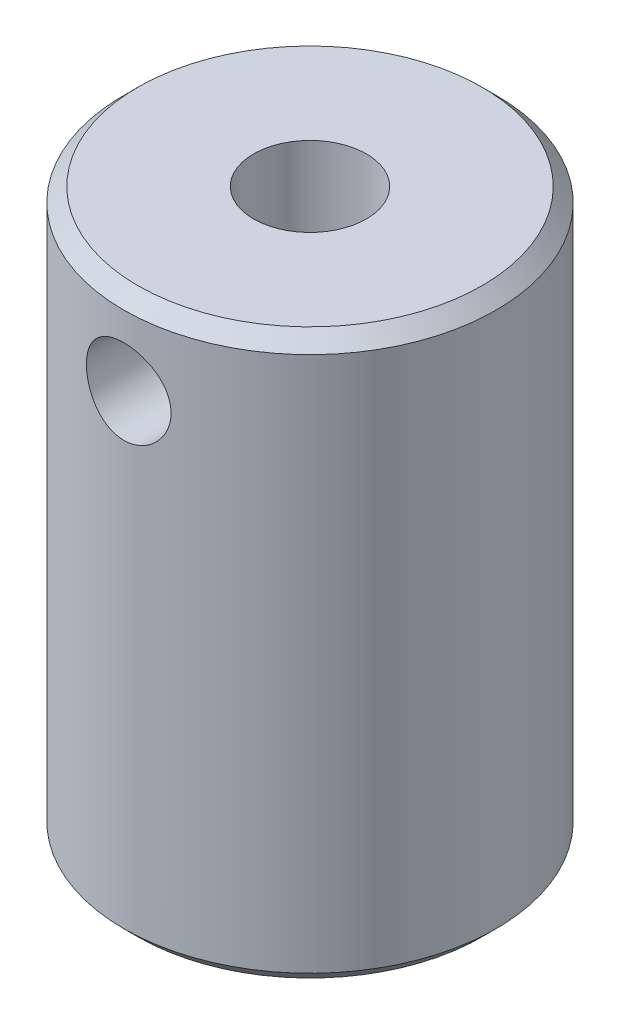
ISO-10303-21;
HEADER;
FILE_DESCRIPTION(('STEP AP214'),'2;1');
FILE_NAME('part.step','',(''),(''),'','','');
FILE_SCHEMA(('AUTOMOTIVE_DESIGN { 1 0 10303 214 1 1 1 1 }'));
ENDSEC;
DATA;
#1=APPLICATION_CONTEXT('core data for automotive mechanical design processes');
#2=APPLICATION_PROTOCOL_DEFINITION('international standard','automotive_design',2000,#1);
#3=PRODUCT_CONTEXT('',#1,'mechanical');
#4=PRODUCT('Part','Part','',(#3));
#5=PRODUCT_RELATED_PRODUCT_CATEGORY('part','',(#4));
#6=PRODUCT_DEFINITION_FORMATION('','',#4);
#7=PRODUCT_DEFINITION_CONTEXT('part definition',#1,'design');
#8=PRODUCT_DEFINITION('design','',#6,#7);
#9=PRODUCT_DEFINITION_SHAPE('','',#8);
#10=(LENGTH_UNIT() NAMED_UNIT(*) SI_UNIT(.MILLI.,.METRE.));
#11=(NAMED_UNIT(*) PLANE_ANGLE_UNIT() SI_UNIT($,.RADIAN.));
#12=(NAMED_UNIT(*) SI_UNIT($,.STERADIAN.) SOLID_ANGLE_UNIT());
#13=UNCERTAINTY_MEASURE_WITH_UNIT(LENGTH_MEASURE(1.E-05),#10,'distance_accuracy_value','');
#14=(GEOMETRIC_REPRESENTATION_CONTEXT(3) GLOBAL_UNCERTAINTY_ASSIGNED_CONTEXT((#13)) GLOBAL_UNIT_ASSIGNED_CONTEXT((#10,
#11,#12)) REPRESENTATION_CONTEXT('',''));
#15=CARTESIAN_POINT('',(0.,0.,0.));
#16=DIRECTION('',(0.,0.,1.));
#17=DIRECTION('',(1.,0.,0.));
#18=AXIS2_PLACEMENT_3D('',#15,#16,#17);
#19=CARTESIAN_POINT('',(0.,-1.2,0.));
#20=DIRECTION('',(0.,1.,0.));
#21=DIRECTION('',(0.,0.,1.));
#22=AXIS2_PLACEMENT_3D('',#19,#20,#21);
#23=CYLINDRICAL_SURFACE('',#22,6.6);
#24=CARTESIAN_POINT('',(0.,-0.700000000000002,0.));
#25=DIRECTION('',(0.,1.,0.));
#26=DIRECTION('',(0.,0.,1.));
#27=AXIS2_PLACEMENT_3D('',#24,#25,#26);
#28=CIRCLE('',#27,6.6);
#29=CARTESIAN_POINT('',(0.,-0.700000000000002,6.6));
#30=VERTEX_POINT('',#29);
#31=EDGE_CURVE('E53',#30,#30,#28,.T.);
#32=ORIENTED_EDGE('',*,*,#31,.T.);
#33=EDGE_LOOP('',(#32));
#34=FACE_BOUND('',#33,.T.);
#35=CARTESIAN_POINT('',(0.,18.3,0.));
#36=DIRECTION('',(0.,1.,0.));
#37=DIRECTION('',(0.,0.,1.));
#38=AXIS2_PLACEMENT_3D('',#35,#36,#37);
#39=CIRCLE('',#38,6.6);
#40=CARTESIAN_POINT('',(0.,18.3,6.6));
#41=VERTEX_POINT('',#40);
#42=EDGE_CURVE('E49',#41,#41,#39,.F.);
#43=ORIENTED_EDGE('',*,*,#42,.T.);
#44=EDGE_LOOP('',(#43));
#45=FACE_BOUND('',#44,.T.);
#46=CARTESIAN_POINT('',(0.,14.3,6.6));
#47=CARTESIAN_POINT('',(-0.0831109671581425,14.3000027190958,6.59999848411111));
#48=CARTESIAN_POINT('',(-0.166254103354805,14.3069307365461,6.59841425607678));
#49=CARTESIAN_POINT('',(-0.330173156759594,14.334427685637,6.5922475921836));
#50=CARTESIAN_POINT('',(-0.410947435332438,14.3550058375732,6.58766312977589));
#51=CARTESIAN_POINT('',(-0.56773660319095,14.4091208291791,6.57600571873763));
#52=CARTESIAN_POINT('',(-0.643756556973884,14.4426435967884,6.56893547314043));
#53=CARTESIAN_POINT('',(-0.789091365495396,14.5216502680285,6.55306692097621));
#54=CARTESIAN_POINT('',(-0.858406287019093,14.5671340525054,6.54426863162391));
#55=CARTESIAN_POINT('',(-0.989560562667828,14.669601226764,6.52573594900884));
#56=CARTESIAN_POINT('',(-1.05126776335229,14.726751544085,6.51598918549954));
#57=CARTESIAN_POINT('',(-1.16430833889966,14.8505713844823,6.49674390709983));
#58=CARTESIAN_POINT('',(-1.2156407287307,14.9172418104167,6.48724541585598));
#59=CARTESIAN_POINT('',(-1.30706759641072,15.0591992331702,6.46944950215326));
#60=CARTESIAN_POINT('',(-1.34701952613945,15.1345801977835,6.46116789483464));
#61=CARTESIAN_POINT('',(-1.41363641830722,15.291205700349,6.44692176885051));
#62=CARTESIAN_POINT('',(-1.44030310630649,15.372449475237,6.44095694929007));
#63=CARTESIAN_POINT('',(-1.47915209647631,15.5370555122699,6.43214606818983));
#64=CARTESIAN_POINT('',(-1.49156935608452,15.6203595578735,6.4292494784034));
#65=CARTESIAN_POINT('',(-1.50229793070892,15.7879149363279,6.42675140440607));
#66=CARTESIAN_POINT('',(-1.50061112331932,15.8721661415974,6.42714948159482));
#67=CARTESIAN_POINT('',(-1.48336810175258,16.0374637300092,6.43115010215516));
#68=CARTESIAN_POINT('',(-1.46808662759663,16.1185405437169,6.43468916477854));
#69=CARTESIAN_POINT('',(-1.42452410952301,16.2769486916929,6.44447242036459));
#70=CARTESIAN_POINT('',(-1.39624228442573,16.3542798005763,6.45071677588463));
#71=CARTESIAN_POINT('',(-1.32723440641527,16.5037644030863,6.4652684630722));
#72=CARTESIAN_POINT('',(-1.28640427251605,16.5758681106582,6.4735929358695));
#73=CARTESIAN_POINT('',(-1.19353186752245,16.7123015318666,6.49135661059448));
#74=CARTESIAN_POINT('',(-1.14148795342281,16.7766301041584,6.50079597578077));
#75=CARTESIAN_POINT('',(-1.0262191080211,16.8972671370926,6.51999691723504));
#76=CARTESIAN_POINT('',(-0.962761000456967,16.9533526559098,6.52976086410899));
#77=CARTESIAN_POINT('',(-0.827227379045836,17.0541235332243,6.54831015582949));
#78=CARTESIAN_POINT('',(-0.755151684054483,17.0988086520197,6.5570954800976));
#79=CARTESIAN_POINT('',(-0.604144795079495,17.1755722327829,6.57272984547825));
#80=CARTESIAN_POINT('',(-0.525197300608897,17.2076196641734,6.57957410909241));
#81=CARTESIAN_POINT('',(-0.362847073495021,17.2579304035208,6.5905199374019));
#82=CARTESIAN_POINT('',(-0.279445043798234,17.2761958794933,6.59462193346704));
#83=CARTESIAN_POINT('',(-0.112463904115642,17.2980957424836,6.59955900430536));
#84=CARTESIAN_POINT('',(-0.0289266554022247,17.30203441479,6.60046201104676));
#85=CARTESIAN_POINT('',(0.13761233200806,17.2959961760882,6.59909053530379));
#86=CARTESIAN_POINT('',(0.220614109632513,17.2860202883564,6.5968162864747));
#87=CARTESIAN_POINT('',(0.382705006331074,17.2526880998568,6.58938888622449));
#88=CARTESIAN_POINT('',(0.461829022088654,17.2294930721338,6.584270452233));
#89=CARTESIAN_POINT('',(0.615062358526562,17.1705613835258,6.57172836794203));
#90=CARTESIAN_POINT('',(0.689171228593732,17.134823597448,6.56430451083327));
#91=CARTESIAN_POINT('',(0.831516511536335,17.0511985138668,6.54780859650569));
#92=CARTESIAN_POINT('',(0.899646411136316,17.0031346239361,6.53871317913192));
#93=CARTESIAN_POINT('',(1.02698264147431,16.8964524029359,6.51992765738758));
#94=CARTESIAN_POINT('',(1.08618771214782,16.8378325840719,6.51023746931474));
#95=CARTESIAN_POINT('',(1.19521023730857,16.71030142092,6.4911172628692));
#96=CARTESIAN_POINT('',(1.24481619956437,16.6412076549279,6.4816963271552));
#97=CARTESIAN_POINT('',(1.33172288643931,16.4954921655978,6.46440139929624));
#98=CARTESIAN_POINT('',(1.3690241550061,16.4188707752242,6.45652733877554));
#99=CARTESIAN_POINT('',(1.43000158345157,16.2606917182587,6.44329649224042));
#100=CARTESIAN_POINT('',(1.45375629733023,16.179165605754,6.43792522690212));
#101=CARTESIAN_POINT('',(1.48719155004219,16.0131398559805,6.43028466351488));
#102=CARTESIAN_POINT('',(1.49687454804969,15.9286407409182,6.42801482346476));
#103=CARTESIAN_POINT('',(1.50178043528499,15.7612048284135,6.42687017659335));
#104=CARTESIAN_POINT('',(1.49733929100643,15.6782782403998,6.42791648749062));
#105=CARTESIAN_POINT('',(1.4748786924197,15.514388653887,6.43310681081483));
#106=CARTESIAN_POINT('',(1.45685942530206,15.4334256283337,6.43725078053686));
#107=CARTESIAN_POINT('',(1.40792215416366,15.2760539615802,6.4481295616229));
#108=CARTESIAN_POINT('',(1.37705674516797,15.1996281853151,6.45485380012021));
#109=CARTESIAN_POINT('',(1.30334721964128,15.0529911758596,6.47013883396863));
#110=CARTESIAN_POINT('',(1.26050174238734,14.9827806498047,6.47869983791794));
#111=CARTESIAN_POINT('',(1.1629499813463,14.8489193434068,6.49692664358043));
#112=CARTESIAN_POINT('',(1.10800587385701,14.7854445666756,6.50661243352718));
#113=CARTESIAN_POINT('',(0.988293773594506,14.6685060889508,6.5258672915583));
#114=CARTESIAN_POINT('',(0.923523501244055,14.6150447174204,6.53543633199988));
#115=CARTESIAN_POINT('',(0.78488436309034,14.5189171638598,6.55354160334249));
#116=CARTESIAN_POINT('',(0.71089897312572,14.4764157060001,6.56206116970269));
#117=CARTESIAN_POINT('',(0.556653580627015,14.4045200176022,6.57693843308396));
#118=CARTESIAN_POINT('',(0.476398706602618,14.375115203128,6.58329787480034));
#119=CARTESIAN_POINT('',(0.330097842923774,14.3352632562943,6.59205357076702));
#120=CARTESIAN_POINT('',(0.264820866683094,14.3220656073864,6.59501451350992));
#121=CARTESIAN_POINT('',(0.13303608895855,14.3044331158524,6.59898828484425));
#122=CARTESIAN_POINT('',(0.0665283508302605,14.2999978234285,6.60000121343297));
#123=CARTESIAN_POINT('',(0.,14.3,6.6));
#124=B_SPLINE_CURVE_WITH_KNOTS('',3,(#46,#47,#48,#49,#50,#51,#52,#53,#54,#55,#56,#57,#58,#59,
#60,#61,#62,#63,#64,#65,#66,#67,#68,#69,#70,#71,#72,#73,#74,#75,#76,#77,#78,#79,#80,#81,#82,#83,
#84,#85,#86,#87,#88,#89,#90,#91,#92,#93,#94,#95,#96,#97,#98,#99,#100,#101,#102,#103,#104,#105,
#106,#107,#108,#109,#110,#111,#112,#113,#114,#115,#116,#117,#118,#119,#120,#121,#122,#123),
.UNSPECIFIED.,.T.,.F.,(4,2,2,2,2,2,2,2,2,2,2,2,2,2,2,2,2,2,2,2,2,2,2,2,2,2,2,2,2,2,2,2,2,2,2,2,
2,2,4),(0.,0.249089309779989,0.498347044198157,0.747334570531911,0.99631961658315,
1.24915433638085,1.50201305019481,1.75791217784048,2.01377805922943,2.26536146938849,
2.51691138821255,2.76349028504541,3.01008400052383,3.2587809446331,3.50751435178787,
3.76206919082222,4.01662938161918,4.27181078457989,4.52695203701937,4.77664165150057,
5.02631290478176,5.27300145689422,5.5197121447385,5.77017677597261,6.02067673635405,
6.27618792924237,6.53168782535687,6.78569065145394,7.03964908265639,7.28761226370872,
7.53557202635721,7.78252641945688,8.02950887359081,8.28186615471546,8.53428207012041,
8.7902956647208,9.04610198713293,9.24550228634616,9.44489234948402),.UNSPECIFIED.);
#125=CARTESIAN_POINT('',(0.,14.3,6.6));
#126=VERTEX_POINT('',#125);
#127=EDGE_CURVE('E65',#126,#126,#124,.T.);
#128=ORIENTED_EDGE('',*,*,#127,.T.);
#129=EDGE_LOOP('',(#128));
#130=FACE_BOUND('',#129,.T.);
#131=ADVANCED_FACE('F36',(#34,#45,#130),#23,.T.);
#132=CARTESIAN_POINT('',(0.,5.4,0.));
#133=DIRECTION('',(0.,1.,0.));
#134=DIRECTION('',(0.,0.,1.));
#135=AXIS2_PLACEMENT_3D('',#132,#133,#134);
#136=CYLINDRICAL_SURFACE('',#135,2.);
#137=CARTESIAN_POINT('',(0.,5.4,0.));
#138=DIRECTION('',(0.,1.,0.));
#139=DIRECTION('',(0.,0.,1.));
#140=AXIS2_PLACEMENT_3D('',#137,#138,#139);
#141=CIRCLE('',#140,2.);
#142=CARTESIAN_POINT('',(0.,5.4,2.));
#143=VERTEX_POINT('',#142);
#144=EDGE_CURVE('E61',#143,#143,#141,.T.);
#145=ORIENTED_EDGE('',*,*,#144,.F.);
#146=EDGE_LOOP('',(#145));
#147=FACE_BOUND('',#146,.T.);
#148=CARTESIAN_POINT('',(0.,18.8,0.));
#149=DIRECTION('',(0.,1.,0.));
#150=DIRECTION('',(0.,0.,1.));
#151=AXIS2_PLACEMENT_3D('',#148,#149,#150);
#152=CIRCLE('',#151,2.);
#153=CARTESIAN_POINT('',(0.,18.8,2.));
#154=VERTEX_POINT('',#153);
#155=EDGE_CURVE('E62',#154,#154,#152,.T.);
#156=ORIENTED_EDGE('',*,*,#155,.T.);
#157=EDGE_LOOP('',(#156));
#158=FACE_BOUND('',#157,.T.);
#159=CARTESIAN_POINT('',(0.,14.3,2.));
#160=CARTESIAN_POINT('',(-0.0732207358411544,14.300004792012,1.99999540196395));
#161=CARTESIAN_POINT('',(-0.146561062021485,14.3054050243745,1.99593645526274));
#162=CARTESIAN_POINT('',(-0.290936396286467,14.3266670634102,1.98006607281083));
#163=CARTESIAN_POINT('',(-0.361965136229004,14.3425551716501,1.96823514679854));
#164=CARTESIAN_POINT('',(-0.499234626631249,14.3837129092838,1.9379567495606));
#165=CARTESIAN_POINT('',(-0.565501615403737,14.4089255135692,1.91954951932009));
#166=CARTESIAN_POINT('',(-0.692422335520753,14.4675423441872,1.87750556721694));
#167=CARTESIAN_POINT('',(-0.753077701796333,14.5009441741935,1.85387037535483));
#168=CARTESIAN_POINT('',(-0.873465937590145,14.5782630115908,1.80049544543983));
#169=CARTESIAN_POINT('',(-0.932593229272033,14.6228673293341,1.77039308548439));
#170=CARTESIAN_POINT('',(-1.04302716767671,14.7194958373612,1.70767017883377));
#171=CARTESIAN_POINT('',(-1.09432148272226,14.7715314827998,1.67504578078609));
#172=CARTESIAN_POINT('',(-1.19837161436623,14.8935829532784,1.6027112365199));
#173=CARTESIAN_POINT('',(-1.24930578421204,14.9651036771217,1.56290854864639));
#174=CARTESIAN_POINT('',(-1.33861998176348,15.1174510123665,1.48711444664135));
#175=CARTESIAN_POINT('',(-1.37701716983077,15.1982646970003,1.45111786883675));
#176=CARTESIAN_POINT('',(-1.42880627811789,15.3395028386762,1.39977155180178));
#177=CARTESIAN_POINT('',(-1.44625674456539,15.3973906971284,1.38157751186733));
#178=CARTESIAN_POINT('',(-1.47420672564844,15.5163927347849,1.35171594150685));
#179=CARTESIAN_POINT('',(-1.48472215355267,15.5774991778748,1.34003347910832));
#180=CARTESIAN_POINT('',(-1.49812822141446,15.7021825855308,1.32503759684552));
#181=CARTESIAN_POINT('',(-1.50094954854207,15.7657768067241,1.32180026676597));
#182=CARTESIAN_POINT('',(-1.49848213241869,15.8926149108816,1.32459531776068));
#183=CARTESIAN_POINT('',(-1.49319048157349,15.9558586600874,1.33063102218113));
#184=CARTESIAN_POINT('',(-1.47597739291882,16.0731913474258,1.34967623262519));
#185=CARTESIAN_POINT('',(-1.46482486380817,16.1275363710462,1.36187157059871));
#186=CARTESIAN_POINT('',(-1.43705671120733,16.2334388787209,1.39114192844939));
#187=CARTESIAN_POINT('',(-1.42043583681172,16.2849936278236,1.40822163640769));
#188=CARTESIAN_POINT('',(-1.37033064172535,16.4162563866341,1.45741769294306));
#189=CARTESIAN_POINT('',(-1.3328014849398,16.4934004166435,1.49225649139232));
#190=CARTESIAN_POINT('',(-1.24618023314519,16.6391965238691,1.56533298145196));
#191=CARTESIAN_POINT('',(-1.19706004255878,16.7078273392547,1.60357878886109));
#192=CARTESIAN_POINT('',(-1.08651604102135,16.8377533904037,1.68051672313145));
#193=CARTESIAN_POINT('',(-1.02481375526036,16.8988206068815,1.71919586730239));
#194=CARTESIAN_POINT('',(-0.890422521709588,17.0102636467812,1.79248037980973));
#195=CARTESIAN_POINT('',(-0.817755054293754,17.0606599202304,1.8270934826376));
#196=CARTESIAN_POINT('',(-0.67790208045414,17.1399807992403,1.88279726073643));
#197=CARTESIAN_POINT('',(-0.612539870185617,17.1711845942158,1.90520770945008));
#198=CARTESIAN_POINT('',(-0.476352173202083,17.2242248804639,1.94372904416948));
#199=CARTESIAN_POINT('',(-0.405530141063763,17.2460672384993,1.95984387504352));
#200=CARTESIAN_POINT('',(-0.259676232483515,17.2792533628864,1.98445588635989));
#201=CARTESIAN_POINT('',(-0.18462128140594,17.2905321789386,1.99290592971749));
#202=CARTESIAN_POINT('',(-0.0332012397969141,17.3015495973717,2.00115883659445));
#203=CARTESIAN_POINT('',(0.0431632843727264,17.3012930686954,2.00096534845408));
#204=CARTESIAN_POINT('',(0.186804217329628,17.2898891307268,1.99242547175873));
#205=CARTESIAN_POINT('',(0.254222327546135,17.2798394631113,1.98490086600401));
#206=CARTESIAN_POINT('',(0.38611067060912,17.2510262199921,1.96351320201588));
#207=CARTESIAN_POINT('',(0.450580272987263,17.2322607903106,1.94964879507262));
#208=CARTESIAN_POINT('',(0.577416779689772,17.1861124694069,1.91599830683313));
#209=CARTESIAN_POINT('',(0.639629172536141,17.1584488185726,1.89602050290193));
#210=CARTESIAN_POINT('',(0.758518527043075,17.0958275445744,1.85166985411963));
#211=CARTESIAN_POINT('',(0.815194721336406,17.0608689123603,1.82729640132067));
#212=CARTESIAN_POINT('',(0.93151162631904,16.9782167535894,1.77119146886499));
#213=CARTESIAN_POINT('',(0.990066762698705,16.9293714605625,1.73891095025037));
#214=CARTESIAN_POINT('',(1.09871974855854,16.8239912474116,1.67238952874785));
#215=CARTESIAN_POINT('',(1.14879830469577,16.7674393003066,1.63814438507395));
#216=CARTESIAN_POINT('',(1.24877541075627,16.6358501190388,1.56369128291496));
#217=CARTESIAN_POINT('',(1.29683043648705,16.5593424385077,1.523587185201));
#218=CARTESIAN_POINT('',(1.37923235998283,16.3966399220275,1.4494059134845));
#219=CARTESIAN_POINT('',(1.41362000515519,16.3104748780914,1.41531099570969));
#220=CARTESIAN_POINT('',(1.45615734256768,16.1645855511255,1.37118877808582));
#221=CARTESIAN_POINT('',(1.46931009512996,16.1076088735976,1.35695811824564));
#222=CARTESIAN_POINT('',(1.48891522181906,15.9912929530168,1.3354205610301));
#223=CARTESIAN_POINT('',(1.4953825519924,15.9319592931977,1.32809821220233));
#224=CARTESIAN_POINT('',(1.50115320209064,15.8121709201887,1.32157601792208));
#225=CARTESIAN_POINT('',(1.50042015325262,15.7517120569904,1.32241740684975));
#226=CARTESIAN_POINT('',(1.49176883838219,15.6319431612478,1.33216448543666));
#227=CARTESIAN_POINT('',(1.48384130024585,15.5726347121027,1.34108058157484));
#228=CARTESIAN_POINT('',(1.45893841819723,15.4440854285892,1.36817348797773));
#229=CARTESIAN_POINT('',(1.44036567954111,15.3755028198672,1.38794705950643));
#230=CARTESIAN_POINT('',(1.39469627266118,15.2434651511695,1.4338296338541));
#231=CARTESIAN_POINT('',(1.36757807297729,15.1800235579618,1.4599546014693));
#232=CARTESIAN_POINT('',(1.29498918933642,15.0374793695137,1.52516477328824));
#233=CARTESIAN_POINT('',(1.2464154206597,14.9605784172442,1.56560203191105));
#234=CARTESIAN_POINT('',(1.13650718465936,14.8168739550224,1.64713510181273));
#235=CARTESIAN_POINT('',(1.07516134758577,14.7500795340551,1.68823146954223));
#236=CARTESIAN_POINT('',(0.939627144937886,14.6271681577167,1.76728988939794));
#237=CARTESIAN_POINT('',(0.865337161562854,14.5711436806228,1.80522333711072));
#238=CARTESIAN_POINT('',(0.705159098936196,14.4727769488546,1.87357289668097));
#239=CARTESIAN_POINT('',(0.619299420401785,14.4304020254275,1.90400691592959));
#240=CARTESIAN_POINT('',(0.464840290356444,14.3722005790143,1.94636704624048));
#241=CARTESIAN_POINT('',(0.398553614774722,14.3522332686238,1.96110322499718));
#242=CARTESIAN_POINT('',(0.262841610392749,14.3215820973885,1.98383739970238));
#243=CARTESIAN_POINT('',(0.193425623834895,14.31087230975,1.99185421210894));
#244=CARTESIAN_POINT('',(0.10296330986188,14.3033953057857,1.99745471706309));
#245=CARTESIAN_POINT('',(0.0824069459941161,14.3021237225106,1.9984076143208));
#246=CARTESIAN_POINT('',(0.0412368896243742,14.300425326769,1.99968095423138));
#247=CARTESIAN_POINT('',(0.0206231884283861,14.2999986502926,2.00000129507253));
#248=CARTESIAN_POINT('',(0.,14.3,2.));
#249=B_SPLINE_CURVE_WITH_KNOTS('',3,(#159,#160,#161,#162,#163,#164,#165,#166,#167,#168,#169,
#170,#171,#172,#173,#174,#175,#176,#177,#178,#179,#180,#181,#182,#183,#184,#185,#186,#187,#188,
#189,#190,#191,#192,#193,#194,#195,#196,#197,#198,#199,#200,#201,#202,#203,#204,#205,#206,#207,
#208,#209,#210,#211,#212,#213,#214,#215,#216,#217,#218,#219,#220,#221,#222,#223,#224,#225,#226,
#227,#228,#229,#230,#231,#232,#233,#234,#235,#236,#237,#238,#239,#240,#241,#242,#243,#244,#245,
#246,#247,#248),.UNSPECIFIED.,.T.,.F.,(4,2,2,2,2,2,2,2,2,2,2,2,2,2,2,2,2,2,2,2,2,2,2,2,2,2,2,2,
2,2,2,2,2,2,2,2,2,2,2,2,2,2,2,2,4),(0.,0.219571786572042,0.439696319423244,0.658496333573381,
0.877232398849293,1.1162243131743,1.35558868405162,1.64360015887451,1.93121574056507,
2.11999518529901,2.3083399319529,2.49837587621257,2.6884799430021,2.85826890162709,
3.0282213760064,3.3044933180591,3.5814419235789,3.86535883938091,4.14872662493692,
4.3752650500639,4.60166129643118,4.829440581669,5.05712372466614,5.26191187011995,
5.46674360185813,5.67880439483681,5.89089453977542,6.13840382081869,6.38646908985453,
6.68168596015948,6.97601595850114,7.15589161422935,7.3353639911421,7.51574333854743,
7.69635548563856,7.91639670960137,8.13699685139924,8.4341224665577,8.73151372390895,
9.03135449492652,9.33047220273167,9.54195697541632,9.75284752283259,9.81468166878713,
9.87652576630967),.UNSPECIFIED.);
#250=CARTESIAN_POINT('',(0.,14.3,2.));
#251=VERTEX_POINT('',#250);
#252=EDGE_CURVE('E40',#251,#251,#249,.T.);
#253=ORIENTED_EDGE('',*,*,#252,.F.);
#254=EDGE_LOOP('',(#253));
#255=FACE_BOUND('',#254,.T.);
#256=ADVANCED_FACE('F84',(#147,#158,#255),#136,.F.);
#257=CARTESIAN_POINT('',(0.,-1.2,0.));
#258=DIRECTION('',(0.,1.,0.));
#259=DIRECTION('',(0.,0.,1.));
#260=AXIS2_PLACEMENT_3D('',#257,#258,#259);
#261=PLANE('',#260);
#262=CARTESIAN_POINT('',(0.,-1.2,0.));
#263=DIRECTION('',(0.,1.,0.));
#264=DIRECTION('',(0.,0.,1.));
#265=AXIS2_PLACEMENT_3D('',#262,#263,#264);
#266=CIRCLE('',#265,6.1);
#267=CARTESIAN_POINT('',(0.,-1.2,6.1));
#268=VERTEX_POINT('',#267);
#269=EDGE_CURVE('E10',#268,#268,#266,.F.);
#270=ORIENTED_EDGE('',*,*,#269,.T.);
#271=EDGE_LOOP('',(#270));
#272=FACE_BOUND('',#271,.T.);
#273=ADVANCED_FACE('F88',(#272),#261,.F.);
#274=CARTESIAN_POINT('',(0.,18.8,0.));
#275=DIRECTION('',(0.,1.,0.));
#276=DIRECTION('',(0.,0.,1.));
#277=AXIS2_PLACEMENT_3D('',#274,#275,#276);
#278=PLANE('',#277);
#279=ORIENTED_EDGE('',*,*,#155,.F.);
#280=EDGE_LOOP('',(#279));
#281=FACE_BOUND('',#280,.T.);
#282=CARTESIAN_POINT('',(0.,18.8,0.));
#283=DIRECTION('',(0.,1.,0.));
#284=DIRECTION('',(0.,0.,1.));
#285=AXIS2_PLACEMENT_3D('',#282,#283,#284);
#286=CIRCLE('',#285,6.1);
#287=CARTESIAN_POINT('',(0.,18.8,6.1));
#288=VERTEX_POINT('',#287);
#289=EDGE_CURVE('E58',#288,#288,#286,.T.);
#290=ORIENTED_EDGE('',*,*,#289,.T.);
#291=EDGE_LOOP('',(#290));
#292=FACE_BOUND('',#291,.T.);
#293=ADVANCED_FACE('F90',(#281,#292),#278,.T.);
#294=CARTESIAN_POINT('',(0.,18.8,0.));
#295=DIRECTION('',(0.,-1.,0.));
#296=DIRECTION('',(0.,0.,-1.));
#297=AXIS2_PLACEMENT_3D('',#294,#295,#296);
#298=CONICAL_SURFACE('',#297,6.1,0.785398163397447);
#299=ORIENTED_EDGE('',*,*,#42,.F.);
#300=EDGE_LOOP('',(#299));
#301=FACE_BOUND('',#300,.T.);
#302=ORIENTED_EDGE('',*,*,#289,.F.);
#303=EDGE_LOOP('',(#302));
#304=FACE_BOUND('',#303,.T.);
#305=ADVANCED_FACE('F92',(#301,#304),#298,.T.);
#306=CARTESIAN_POINT('',(0.,-0.700000000000002,0.));
#307=DIRECTION('',(0.,1.,0.));
#308=DIRECTION('',(0.,0.,1.));
#309=AXIS2_PLACEMENT_3D('',#306,#307,#308);
#310=CONICAL_SURFACE('',#309,6.6,0.785398163397448);
#311=ORIENTED_EDGE('',*,*,#269,.F.);
#312=EDGE_LOOP('',(#311));
#313=FACE_BOUND('',#312,.T.);
#314=ORIENTED_EDGE('',*,*,#31,.F.);
#315=EDGE_LOOP('',(#314));
#316=FACE_BOUND('',#315,.T.);
#317=ADVANCED_FACE('F38',(#313,#316),#310,.T.);
#318=CARTESIAN_POINT('',(0.,5.4,0.));
#319=DIRECTION('',(0.,1.,0.));
#320=DIRECTION('',(0.,0.,1.));
#321=AXIS2_PLACEMENT_3D('',#318,#319,#320);
#322=PLANE('',#321);
#323=ORIENTED_EDGE('',*,*,#144,.T.);
#324=EDGE_LOOP('',(#323));
#325=FACE_BOUND('',#324,.T.);
#326=ADVANCED_FACE('F79',(#325),#322,.T.);
#327=CARTESIAN_POINT('',(0.,15.8,13.4));
#328=DIRECTION('',(0.,0.,-1.));
#329=DIRECTION('',(-1.,0.,0.));
#330=AXIS2_PLACEMENT_3D('',#327,#328,#329);
#331=CYLINDRICAL_SURFACE('',#330,1.5);
#332=ORIENTED_EDGE('',*,*,#127,.F.);
#333=EDGE_LOOP('',(#332));
#334=FACE_BOUND('',#333,.T.);
#335=ORIENTED_EDGE('',*,*,#252,.T.);
#336=EDGE_LOOP('',(#335));
#337=FACE_BOUND('',#336,.T.);
#338=ADVANCED_FACE('F75',(#334,#337),#331,.F.);
#339=CLOSED_SHELL('',(#131,#256,#273,#293,#305,#317,#326,#338));
#340=MANIFOLD_SOLID_BREP('B2',#339);
#341=ADVANCED_BREP_SHAPE_REPRESENTATION('',(#18,#340),#14);
#342=SHAPE_DEFINITION_REPRESENTATION(#9,#341);
ENDSEC;
END-ISO-10303-21;
